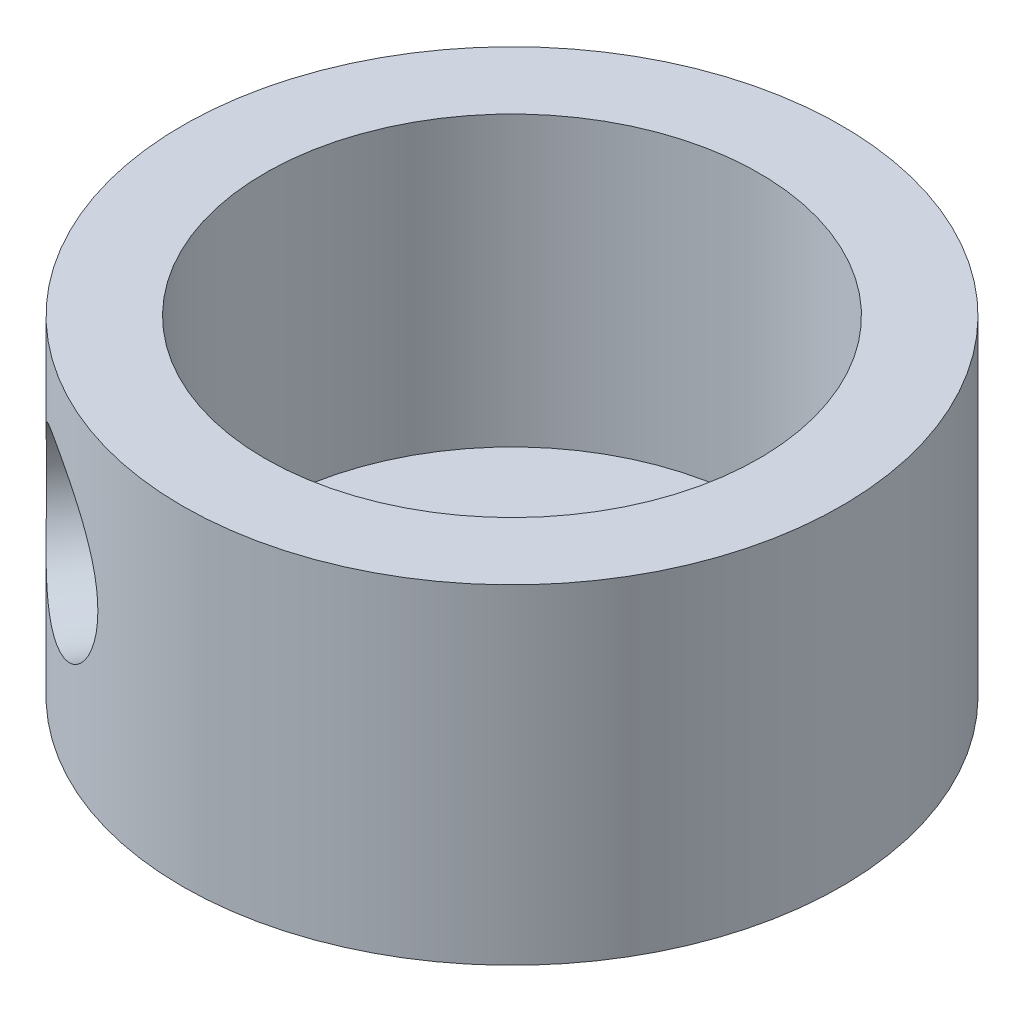
ISO-10303-21;
HEADER;
FILE_DESCRIPTION(('STEP AP214'),'2;1');
FILE_NAME('part.step','',(''),(''),'','','');
FILE_SCHEMA(('AUTOMOTIVE_DESIGN { 1 0 10303 214 1 1 1 1 }'));
ENDSEC;
DATA;
#1=APPLICATION_CONTEXT('core data for automotive mechanical design processes');
#2=APPLICATION_PROTOCOL_DEFINITION('international standard','automotive_design',2000,#1);
#3=PRODUCT_CONTEXT('',#1,'mechanical');
#4=PRODUCT('Part','Part','',(#3));
#5=PRODUCT_RELATED_PRODUCT_CATEGORY('part','',(#4));
#6=PRODUCT_DEFINITION_FORMATION('','',#4);
#7=PRODUCT_DEFINITION_CONTEXT('part definition',#1,'design');
#8=PRODUCT_DEFINITION('design','',#6,#7);
#9=PRODUCT_DEFINITION_SHAPE('','',#8);
#10=(LENGTH_UNIT() NAMED_UNIT(*) SI_UNIT(.MILLI.,.METRE.));
#11=(NAMED_UNIT(*) PLANE_ANGLE_UNIT() SI_UNIT($,.RADIAN.));
#12=(NAMED_UNIT(*) SI_UNIT($,.STERADIAN.) SOLID_ANGLE_UNIT());
#13=UNCERTAINTY_MEASURE_WITH_UNIT(LENGTH_MEASURE(1.E-05),#10,'distance_accuracy_value','');
#14=(GEOMETRIC_REPRESENTATION_CONTEXT(3) GLOBAL_UNCERTAINTY_ASSIGNED_CONTEXT((#13)) GLOBAL_UNIT_ASSIGNED_CONTEXT((#10,
#11,#12)) REPRESENTATION_CONTEXT('',''));
#15=CARTESIAN_POINT('',(0.,0.,0.));
#16=DIRECTION('',(0.,0.,1.));
#17=DIRECTION('',(1.,0.,0.));
#18=AXIS2_PLACEMENT_3D('',#15,#16,#17);
#19=CARTESIAN_POINT('',(0.,40.,0.));
#20=DIRECTION('',(0.,-1.,0.));
#21=DIRECTION('',(0.,0.,-1.));
#22=AXIS2_PLACEMENT_3D('',#19,#20,#21);
#23=CYLINDRICAL_SURFACE('',#22,40.);
#24=CARTESIAN_POINT('',(-12.1692253879626,21.9418173695324,38.1039361937447));
#25=CARTESIAN_POINT('',(-12.1692267008955,21.6524061057254,38.1039361952453));
#26=CARTESIAN_POINT('',(-12.1810513771062,21.362973564748,38.1001655139612));
#27=CARTESIAN_POINT('',(-12.2282117828224,20.7862139709595,38.0850553099959));
#28=CARTESIAN_POINT('',(-12.2635498384767,20.4988871293061,38.0737150384643));
#29=CARTESIAN_POINT('',(-12.357334717333,19.9283102835781,38.0433792550439));
#30=CARTESIAN_POINT('',(-12.4157917169252,19.6450621318229,38.0243803719516));
#31=CARTESIAN_POINT('',(-12.5551335186714,19.0847779407023,37.9785991282147));
#32=CARTESIAN_POINT('',(-12.6360189102535,18.807742064805,37.9518165630105));
#33=CARTESIAN_POINT('',(-12.8191765643407,18.2621847864961,37.8903420520787));
#34=CARTESIAN_POINT('',(-12.9214182721969,17.9936518442132,37.855661399875));
#35=CARTESIAN_POINT('',(-13.1462635681445,17.4664712282518,37.778166768958));
#36=CARTESIAN_POINT('',(-13.2688672417041,17.2078235960718,37.7353527561053));
#37=CARTESIAN_POINT('',(-13.5331730858816,16.7021095761881,37.6413719958643));
#38=CARTESIAN_POINT('',(-13.6748728453942,16.4550417316995,37.5902063028017));
#39=CARTESIAN_POINT('',(-13.976065713182,15.9739214188942,37.4792655005315));
#40=CARTESIAN_POINT('',(-14.1355647261885,15.7398733085645,37.4194875323589));
#41=CARTESIAN_POINT('',(-14.474505417927,15.2813904311062,37.2897080268784));
#42=CARTESIAN_POINT('',(-14.6543052526515,15.057275254471,37.2195124900569));
#43=CARTESIAN_POINT('',(-15.029275425357,14.625672699787,37.0696861739529));
#44=CARTESIAN_POINT('',(-15.2244459454494,14.4181855188051,36.990055282875));
#45=CARTESIAN_POINT('',(-15.6284988523279,14.0211371812701,36.8211620039586));
#46=CARTESIAN_POINT('',(-15.8373850145809,13.8315809958751,36.7318969597639));
#47=CARTESIAN_POINT('',(-16.2669614380952,13.4717949658277,36.5436851864258));
#48=CARTESIAN_POINT('',(-16.4876475332546,13.3015583655956,36.4447418642096));
#49=CARTESIAN_POINT('',(-16.9425966886944,12.9790047618284,36.235508452014));
#50=CARTESIAN_POINT('',(-17.1770185813707,12.8270113060357,36.1250645183413));
#51=CARTESIAN_POINT('',(-17.6542109066331,12.545254159727,35.8942763030943));
#52=CARTESIAN_POINT('',(-17.8969814516914,12.4154907688333,35.7739318881113));
#53=CARTESIAN_POINT('',(-18.3887784105217,12.1792419517963,35.5236391176051));
#54=CARTESIAN_POINT('',(-18.6378040311446,12.0727535908062,35.3936919756986));
#55=CARTESIAN_POINT('',(-19.140030148405,11.883926864499,35.1246407095224));
#56=CARTESIAN_POINT('',(-19.3932305374529,11.8015878778434,34.9855368209592));
#57=CARTESIAN_POINT('',(-19.896021008704,11.6633317736928,34.7020141115305));
#58=CARTESIAN_POINT('',(-20.1455662164313,11.6068679674241,34.5577821932474));
#59=CARTESIAN_POINT('',(-20.6446228150314,11.518201867452,34.2619858881538));
#60=CARTESIAN_POINT('',(-20.8941342063128,11.4859992482292,34.1104215997527));
#61=CARTESIAN_POINT('',(-21.3911352347049,11.4461435851059,33.8009617487546));
#62=CARTESIAN_POINT('',(-21.6386251522031,11.438487076823,33.643067082798));
#63=CARTESIAN_POINT('',(-22.1297370413295,11.4477828359071,33.3220766182041));
#64=CARTESIAN_POINT('',(-22.3733590661844,11.4647347643359,33.1589808912325));
#65=CARTESIAN_POINT('',(-22.8490610583845,11.522378764757,32.8329335262139));
#66=CARTESIAN_POINT('',(-23.0812775784324,11.56247943046,32.6700761276478));
#67=CARTESIAN_POINT('',(-23.5388194080397,11.6656152779254,32.3419731937816));
#68=CARTESIAN_POINT('',(-23.7641448492847,11.7286500211301,32.1767277042058));
#69=CARTESIAN_POINT('',(-24.2065365827703,11.8771427976013,31.8452507327506));
#70=CARTESIAN_POINT('',(-24.423602591382,11.9626016001157,31.6790192172371));
#71=CARTESIAN_POINT('',(-24.8482463182025,12.1552712343312,31.3470460655612));
#72=CARTESIAN_POINT('',(-25.0558238902644,12.262482400938,31.181304436981));
#73=CARTESIAN_POINT('',(-25.462343646605,12.4989712164321,30.8502581339815));
#74=CARTESIAN_POINT('',(-25.6611849701708,12.6284489654126,30.684972594657));
#75=CARTESIAN_POINT('',(-26.0472303631279,12.9078595658856,30.3579613431688));
#76=CARTESIAN_POINT('',(-26.2344300786855,13.0578000040229,30.196236977277));
#77=CARTESIAN_POINT('',(-26.5962617391237,13.3770204033584,29.8780337390284));
#78=CARTESIAN_POINT('',(-26.7708967605732,13.546295603833,29.7215535876299));
#79=CARTESIAN_POINT('',(-27.1070416268895,13.903173853733,29.4153025609572));
#80=CARTESIAN_POINT('',(-27.2685453986238,14.0907852962332,29.2655348043382));
#81=CARTESIAN_POINT('',(-27.5823684072209,14.4889263812809,28.9699981213541));
#82=CARTESIAN_POINT('',(-27.7342704257418,14.6999724404849,28.8244814268118));
#83=CARTESIAN_POINT('',(-28.0228325646942,15.1386748345272,28.5440244462936));
#84=CARTESIAN_POINT('',(-28.1594992474103,15.3663239475243,28.4090796142244));
#85=CARTESIAN_POINT('',(-28.4172579625968,15.836945843765,28.1512469733754));
#86=CARTESIAN_POINT('',(-28.538342398712,16.0799260155382,28.0283650521437));
#87=CARTESIAN_POINT('',(-28.7643973337685,16.5794195509303,27.7963249976253));
#88=CARTESIAN_POINT('',(-28.8693741563245,16.8359275503044,27.6871614817543));
#89=CARTESIAN_POINT('',(-29.0634895907983,17.3624458011271,27.4833315279053));
#90=CARTESIAN_POINT('',(-29.15252854211,17.6325283505538,27.3887567901486));
#91=CARTESIAN_POINT('',(-29.3136546209009,18.1828791405613,27.2162377282245));
#92=CARTESIAN_POINT('',(-29.3857416248322,18.4631474553598,27.1382935252628));
#93=CARTESIAN_POINT('',(-29.5126708376414,19.0318002867341,27.0002048783374));
#94=CARTESIAN_POINT('',(-29.5675164274598,19.3201831999854,26.9400569447656));
#95=CARTESIAN_POINT('',(-29.659756574985,19.9029719417634,26.8384716024016));
#96=CARTESIAN_POINT('',(-29.6971516470086,20.1973775925157,26.7970336421741));
#97=CARTESIAN_POINT('',(-29.7535034127387,20.7813622454133,26.7344488203575));
#98=CARTESIAN_POINT('',(-29.7729635473698,21.0708334917613,26.7127481713975));
#99=CARTESIAN_POINT('',(-29.7952024817744,21.6512083352435,26.687940924605));
#100=CARTESIAN_POINT('',(-29.7979816027159,21.9421119046925,26.6848339687789));
#101=CARTESIAN_POINT('',(-29.7868478560983,22.5231713015332,26.6972613288431));
#102=CARTESIAN_POINT('',(-29.7729365630349,22.8133271968694,26.7127938863688));
#103=CARTESIAN_POINT('',(-29.7284825690653,23.3907799331844,26.7622575046431));
#104=CARTESIAN_POINT('',(-29.6979399546191,23.6780767890185,26.7961884697452));
#105=CARTESIAN_POINT('',(-29.6210673712667,24.2424469616863,26.8811379486277));
#106=CARTESIAN_POINT('',(-29.5750401724093,24.5196110805546,26.9318284579706));
#107=CARTESIAN_POINT('',(-29.4672598545887,25.0672834816666,27.0497129013157));
#108=CARTESIAN_POINT('',(-29.4055069818024,25.3377918680295,27.116906576969));
#109=CARTESIAN_POINT('',(-29.2665033120336,25.8703450523375,27.2668704901096));
#110=CARTESIAN_POINT('',(-29.1892538331972,26.1323905679375,27.3496394027254));
#111=CARTESIAN_POINT('',(-29.0194865072897,26.6464641388745,27.5297059648681));
#112=CARTESIAN_POINT('',(-28.9269628197408,26.8984883163812,27.6270091705876));
#113=CARTESIAN_POINT('',(-28.7248718725057,27.396015925202,27.8370870123837));
#114=CARTESIAN_POINT('',(-28.6149879218402,27.641271825248,27.9501432734155));
#115=CARTESIAN_POINT('',(-28.3799534982687,28.1181562165687,28.1887617080455));
#116=CARTESIAN_POINT('',(-28.2547961446279,28.3497784956674,28.3143295134399));
#117=CARTESIAN_POINT('',(-27.9896440963899,28.7978650373007,28.5764688816687));
#118=CARTESIAN_POINT('',(-27.8496470305263,29.0143268681126,28.7130422022572));
#119=CARTESIAN_POINT('',(-27.5553671474869,29.4306030208981,28.9955741730295));
#120=CARTESIAN_POINT('',(-27.4010904750463,29.6304244338252,29.1415287781156));
#121=CARTESIAN_POINT('',(-27.0741648903355,30.0176713715582,29.445556753111));
#122=CARTESIAN_POINT('',(-26.9011189505242,30.2045844522948,29.603856450927));
#123=CARTESIAN_POINT('',(-26.5411974896133,30.5582003417578,29.9269659315223));
#124=CARTESIAN_POINT('',(-26.3543271118801,30.7249106066241,30.0917732826022));
#125=CARTESIAN_POINT('',(-25.9674861654638,31.0370191712834,30.4262228461374));
#126=CARTESIAN_POINT('',(-25.7675134380803,31.1824139463657,30.5958658526853));
#127=CARTESIAN_POINT('',(-25.3554691233878,31.4507465808206,30.9381950731188));
#128=CARTESIAN_POINT('',(-25.1433977291198,31.5736847983684,31.1108812384187));
#129=CARTESIAN_POINT('',(-24.7099391825488,31.7952788400849,31.4562411446642));
#130=CARTESIAN_POINT('',(-24.4886344175504,31.8941109253509,31.628905143181));
#131=CARTESIAN_POINT('',(-24.0365254512324,32.067863722887,31.9738374054647));
#132=CARTESIAN_POINT('',(-23.805721267782,32.1427844801338,32.1461056699754));
#133=CARTESIAN_POINT('',(-23.336132915562,32.2680531551015,32.4886031497597));
#134=CARTESIAN_POINT('',(-23.0973501783566,32.3184054560264,32.6588327234615));
#135=CARTESIAN_POINT('',(-22.6134171880446,32.3941047253895,32.9957615314371));
#136=CARTESIAN_POINT('',(-22.3682670911347,32.4194523066209,33.1624608521291));
#137=CARTESIAN_POINT('',(-21.8807731193549,32.4445340306979,33.4860388902287));
#138=CARTESIAN_POINT('',(-21.6385630077092,32.4450083019258,33.6430622288873));
#139=CARTESIAN_POINT('',(-21.1516020890951,32.42220056179,33.9513293357124));
#140=CARTESIAN_POINT('',(-20.906851336052,32.3989190536283,34.1025732262304));
#141=CARTESIAN_POINT('',(-20.4166513709503,32.3288022182398,34.3982889875869));
#142=CARTESIAN_POINT('',(-20.1712021875066,32.2819678425509,34.5427611317467));
#143=CARTESIAN_POINT('',(-19.681472994388,32.1651413898556,34.8241205975523));
#144=CARTESIAN_POINT('',(-19.4371929899558,32.0951492091072,34.9610078852162));
#145=CARTESIAN_POINT('',(-18.9533263740835,31.9331268292183,35.2256577020736));
#146=CARTESIAN_POINT('',(-18.7137192781513,31.8412474994141,35.3534752453339));
#147=CARTESIAN_POINT('',(-18.2392857029248,31.635884274607,35.6005621513135));
#148=CARTESIAN_POINT('',(-18.0044609830951,31.5223925817374,35.719828407233));
#149=CARTESIAN_POINT('',(-17.5415165671477,31.2746803198402,35.9494361352672));
#150=CARTESIAN_POINT('',(-17.3133962355257,31.1404617230936,36.0597784550237));
#151=CARTESIAN_POINT('',(-16.8655945434698,30.8522302740959,36.2713807319676));
#152=CARTESIAN_POINT('',(-16.6459136029976,30.6982164384455,36.3726402375091));
#153=CARTESIAN_POINT('',(-16.2111359453675,30.3671859971198,36.5685301165819));
#154=CARTESIAN_POINT('',(-15.9963065628766,30.1896757696529,36.6629199483829));
#155=CARTESIAN_POINT('',(-15.5791359941981,29.8161151439302,36.8421236018837));
#156=CARTESIAN_POINT('',(-15.376795002313,29.6200644573298,36.9269372746082));
#157=CARTESIAN_POINT('',(-14.9862781005191,29.2106532857522,37.0871410602621));
#158=CARTESIAN_POINT('',(-14.7981058950849,28.9972883039844,37.1625287121079));
#159=CARTESIAN_POINT('',(-14.4376505080415,28.5546658553656,37.3040446449664));
#160=CARTESIAN_POINT('',(-14.2653670370309,28.3254086781123,37.3701730946399));
#161=CARTESIAN_POINT('',(-13.9347715372588,27.8473952101069,37.4947198714325));
#162=CARTESIAN_POINT('',(-13.776836861136,27.5983268720052,37.5529431820243));
#163=CARTESIAN_POINT('',(-13.4808431419729,27.0868863236942,37.6602131195836));
#164=CARTESIAN_POINT('',(-13.3427768335998,26.8245190242614,37.7092631029684));
#165=CARTESIAN_POINT('',(-13.0879713371768,26.2882963774668,37.798455384137));
#166=CARTESIAN_POINT('',(-12.9712238392585,26.0144455576738,37.8386011540133));
#167=CARTESIAN_POINT('',(-12.7603141774663,25.4571073275395,37.9102467005543));
#168=CARTESIAN_POINT('',(-12.6661488440015,25.173621275966,37.9417476906741));
#169=CARTESIAN_POINT('',(-12.5155241802033,24.6480151792859,37.9916676789133));
#170=CARTESIAN_POINT('',(-12.4553748149914,24.4070691971378,38.0114008179503));
#171=CARTESIAN_POINT('',(-12.3518825477692,23.9212061614274,38.0451569673243));
#172=CARTESIAN_POINT('',(-12.3085384621869,23.6762893887886,38.0591803797927));
#173=CARTESIAN_POINT('',(-12.2390318019766,23.1837554072029,38.0815892126762));
#174=CARTESIAN_POINT('',(-12.2128704391076,22.9361380090544,38.089974235462));
#175=CARTESIAN_POINT('',(-12.1779689376924,22.4396245432522,38.1011469959573));
#176=CARTESIAN_POINT('',(-12.1692242587598,22.1907288258134,38.103936192454));
#177=CARTESIAN_POINT('',(-12.1692253879626,21.9418173695324,38.1039361937447));
#178=B_SPLINE_CURVE_WITH_KNOTS('',3,(#24,#25,#26,#27,#28,#29,#30,#31,#32,#33,#34,#35,#36,#37,
#38,#39,#40,#41,#42,#43,#44,#45,#46,#47,#48,#49,#50,#51,#52,#53,#54,#55,#56,#57,#58,#59,#60,#61,
#62,#63,#64,#65,#66,#67,#68,#69,#70,#71,#72,#73,#74,#75,#76,#77,#78,#79,#80,#81,#82,#83,#84,#85,
#86,#87,#88,#89,#90,#91,#92,#93,#94,#95,#96,#97,#98,#99,#100,#101,#102,#103,#104,#105,#106,#107,
#108,#109,#110,#111,#112,#113,#114,#115,#116,#117,#118,#119,#120,#121,#122,#123,#124,#125,#126,
#127,#128,#129,#130,#131,#132,#133,#134,#135,#136,#137,#138,#139,#140,#141,#142,#143,#144,#145,
#146,#147,#148,#149,#150,#151,#152,#153,#154,#155,#156,#157,#158,#159,#160,#161,#162,#163,#164,
#165,#166,#167,#168,#169,#170,#171,#172,#173,#174,#175,#176,#177),.UNSPECIFIED.,.T.,.F.,(4,2,2,
2,2,2,2,2,2,2,2,2,2,2,2,2,2,2,2,2,2,2,2,2,2,2,2,2,2,2,2,2,2,2,2,2,2,2,2,2,2,2,2,2,2,2,2,2,2,2,2,
2,2,2,2,2,2,2,2,2,2,2,2,2,2,2,2,2,2,2,2,2,2,2,2,2,4),(0.,0.868005652453133,1.73609718837711,
2.60457126288123,3.47306816343381,4.34033090665711,5.20759729025118,6.07475427368512,
6.94219978811813,7.82850263944516,8.7148159932442,9.60137435124388,10.4876217403081,
11.3877926771605,12.2879757457839,13.1880452409544,14.0880915762311,14.968129078031,
15.8481547719047,16.7280562554819,17.6079456200664,18.4662921134657,19.3246221939684,
20.1829817229697,21.041354468518,21.9078879402575,22.7747435608817,23.6413861972599,
24.5084273978284,25.4013109152475,26.2938083445773,27.1867392319127,28.0793186656924,
28.9772980494442,29.8752839775695,30.7730937059046,31.6708769715437,32.5426147434665,
33.4143357313299,34.285974491576,35.1576087205456,36.0131047956475,36.868587479242,
37.7239974260461,38.579735221206,39.4534161295581,40.3274920981572,41.2017079482026,
42.0755493432664,42.9741795966059,43.872477180906,44.7709231397697,45.6693547674428,
46.5610057676864,47.4526550907479,48.3441452784079,49.2356136176887,50.1005399603164,
50.9654479822019,51.8303210645343,52.6951980213626,53.5542775673273,54.4136676634974,
55.2729760342201,56.1323271106774,57.0140020122604,57.8956906280675,58.7776089694766,
59.6595112442365,60.5602641122477,61.460686757351,62.3607576736123,63.260702183543,
64.0074349806629,64.7541151768995,65.5008480248303,66.2473861801537),.UNSPECIFIED.);
#179=CARTESIAN_POINT('',(-12.1692253879626,21.9418173695324,38.1039361937447));
#180=VERTEX_POINT('',#179);
#181=EDGE_CURVE('E47',#180,#180,#178,.T.);
#182=ORIENTED_EDGE('',*,*,#181,.T.);
#183=EDGE_LOOP('',(#182));
#184=FACE_BOUND('',#183,.T.);
#185=CARTESIAN_POINT('',(0.,40.,0.));
#186=DIRECTION('',(0.,1.,0.));
#187=DIRECTION('',(0.,0.,1.));
#188=AXIS2_PLACEMENT_3D('',#185,#186,#187);
#189=CIRCLE('',#188,40.);
#190=CARTESIAN_POINT('',(0.,40.,40.));
#191=VERTEX_POINT('',#190);
#192=EDGE_CURVE('E10',#191,#191,#189,.T.);
#193=ORIENTED_EDGE('',*,*,#192,.F.);
#194=EDGE_LOOP('',(#193));
#195=FACE_BOUND('',#194,.T.);
#196=CARTESIAN_POINT('',(0.,0.,0.));
#197=DIRECTION('',(0.,1.,0.));
#198=DIRECTION('',(0.,0.,1.));
#199=AXIS2_PLACEMENT_3D('',#196,#197,#198);
#200=CIRCLE('',#199,40.);
#201=CARTESIAN_POINT('',(0.,0.,40.));
#202=VERTEX_POINT('',#201);
#203=EDGE_CURVE('E35',#202,#202,#200,.T.);
#204=ORIENTED_EDGE('',*,*,#203,.T.);
#205=EDGE_LOOP('',(#204));
#206=FACE_BOUND('',#205,.T.);
#207=ADVANCED_FACE('F31',(#184,#195,#206),#23,.T.);
#208=CARTESIAN_POINT('',(0.,40.,0.));
#209=DIRECTION('',(0.,1.,0.));
#210=DIRECTION('',(0.,0.,1.));
#211=AXIS2_PLACEMENT_3D('',#208,#209,#210);
#212=PLANE('',#211);
#213=CARTESIAN_POINT('',(0.,40.,0.));
#214=DIRECTION('',(0.,1.,0.));
#215=DIRECTION('',(0.,0.,1.));
#216=AXIS2_PLACEMENT_3D('',#213,#214,#215);
#217=CIRCLE('',#216,30.);
#218=CARTESIAN_POINT('',(0.,40.,30.));
#219=VERTEX_POINT('',#218);
#220=EDGE_CURVE('E44',#219,#219,#217,.T.);
#221=ORIENTED_EDGE('',*,*,#220,.F.);
#222=EDGE_LOOP('',(#221));
#223=FACE_BOUND('',#222,.T.);
#224=ORIENTED_EDGE('',*,*,#192,.T.);
#225=EDGE_LOOP('',(#224));
#226=FACE_BOUND('',#225,.T.);
#227=ADVANCED_FACE('F77',(#223,#226),#212,.T.);
#228=CARTESIAN_POINT('',(0.,0.,0.));
#229=DIRECTION('',(0.,1.,0.));
#230=DIRECTION('',(0.,0.,1.));
#231=AXIS2_PLACEMENT_3D('',#228,#229,#230);
#232=PLANE('',#231);
#233=ORIENTED_EDGE('',*,*,#203,.F.);
#234=EDGE_LOOP('',(#233));
#235=FACE_BOUND('',#234,.T.);
#236=ADVANCED_FACE('F75',(#235),#232,.F.);
#237=CARTESIAN_POINT('',(0.,5.,0.));
#238=DIRECTION('',(0.,1.,0.));
#239=DIRECTION('',(0.,0.,1.));
#240=AXIS2_PLACEMENT_3D('',#237,#238,#239);
#241=CYLINDRICAL_SURFACE('',#240,30.);
#242=CARTESIAN_POINT('',(-6.46405933262994,21.9418173695324,29.2953227827283));
#243=CARTESIAN_POINT('',(-6.46405860267126,22.2268356966163,29.295322689692));
#244=CARTESIAN_POINT('',(-6.47617134123439,22.5118458590297,29.2926580557763));
#245=CARTESIAN_POINT('',(-6.52444105103412,23.0797107169084,29.2819446098088));
#246=CARTESIAN_POINT('',(-6.56059714278754,23.362565490833,29.273895994698));
#247=CARTESIAN_POINT('',(-6.65643451474172,23.9240536342009,29.2522526413));
#248=CARTESIAN_POINT('',(-6.71611712376494,24.2026867642743,29.2386575897381));
#249=CARTESIAN_POINT('',(-6.85818253289289,24.753748618966,29.2056611147829));
#250=CARTESIAN_POINT('',(-6.94056571035848,25.0261772403626,29.1862595948658));
#251=CARTESIAN_POINT('',(-7.12673595980626,25.5623630373157,29.1413584245918));
#252=CARTESIAN_POINT('',(-7.23047186129289,25.8261392274004,29.1158733302498));
#253=CARTESIAN_POINT('',(-7.45825514994594,26.3441383091024,29.0583589276308));
#254=CARTESIAN_POINT('',(-7.582310085592,26.5983576070355,29.0263271861878));
#255=CARTESIAN_POINT('',(-7.8493186183117,27.0956353151824,28.9552633027257));
#256=CARTESIAN_POINT('',(-7.99227202118491,27.3386938400496,28.9162312326406));
#257=CARTESIAN_POINT('',(-8.29561691091182,27.8122980330456,28.8306706248768));
#258=CARTESIAN_POINT('',(-8.45600952729929,28.0428428892154,28.784141601528));
#259=CARTESIAN_POINT('',(-8.79931542098473,28.4989266669634,28.6810983938504));
#260=CARTESIAN_POINT('',(-8.9828653861136,28.7239142932937,28.6242640705478));
#261=CARTESIAN_POINT('',(-9.36539864027722,29.1576754051913,28.5013974767708));
#262=CARTESIAN_POINT('',(-9.56438225142715,29.3664485521646,28.4353650142993));
#263=CARTESIAN_POINT('',(-9.97603222707465,29.7665590388786,28.293571182377));
#264=CARTESIAN_POINT('',(-10.188701231066,29.9578929978344,28.2178079333321));
#265=CARTESIAN_POINT('',(-10.6258432913486,30.321857883229,28.0561179678232));
#266=CARTESIAN_POINT('',(-10.850315989472,30.4944893766836,27.9701915596484));
#267=CARTESIAN_POINT('',(-11.3159400867619,30.8246729019546,27.785141309193));
#268=CARTESIAN_POINT('',(-11.5573878710842,30.9816319712193,27.6857036011781));
#269=CARTESIAN_POINT('',(-12.0485639171633,31.2732034511849,27.4755059594678));
#270=CARTESIAN_POINT('',(-12.298288841648,31.4078247398993,27.3647505523393));
#271=CARTESIAN_POINT('',(-12.8038916576969,31.6536442833029,27.131859748488));
#272=CARTESIAN_POINT('',(-13.0597694269601,31.7648430031381,27.0097245778242));
#273=CARTESIAN_POINT('',(-13.5753820991579,31.9627812060115,26.7542847888806));
#274=CARTESIAN_POINT('',(-13.8351168178627,32.0495218533753,26.6209807026886));
#275=CARTESIAN_POINT('',(-14.3461827286018,32.1948605038312,26.3489587103013));
#276=CARTESIAN_POINT('',(-14.5974576445492,32.2544037241027,26.2106397783674));
#277=CARTESIAN_POINT('',(-15.0993081970644,32.3494755141936,25.9247809886034));
#278=CARTESIAN_POINT('',(-15.3498838496657,32.3850046392139,25.7772413440405));
#279=CARTESIAN_POINT('',(-15.8482058747184,32.4316804216233,25.4738971561556));
#280=CARTESIAN_POINT('',(-16.0959529209313,32.4428330112375,25.3180946331268));
#281=CARTESIAN_POINT('',(-16.586692883999,32.4406565678234,24.9993443238581));
#282=CARTESIAN_POINT('',(-16.8296859234958,32.4273281671901,24.8363967222967));
#283=CARTESIAN_POINT('',(-17.2986952203289,32.3774358281665,24.5118935976791));
#284=CARTESIAN_POINT('',(-17.5249911879668,32.341901769608,24.3505826767432));
#285=CARTESIAN_POINT('',(-17.9700759569619,32.2488886933543,24.0239995785818));
#286=CARTESIAN_POINT('',(-18.1888650138897,32.1914104235529,23.8587275365376));
#287=CARTESIAN_POINT('',(-18.6176633819252,32.0550220840179,23.525652458162));
#288=CARTESIAN_POINT('',(-18.8276723697161,31.9761112258524,23.357849328935));
#289=CARTESIAN_POINT('',(-19.2378137067506,31.7975281820049,23.0212275243502));
#290=CARTESIAN_POINT('',(-19.4379458212639,31.6978555031983,22.8524088249635));
#291=CARTESIAN_POINT('',(-19.8300691074867,31.4770533681901,22.5130297367548));
#292=CARTESIAN_POINT('',(-20.0219130898796,31.3556512864779,22.342476771742));
#293=CARTESIAN_POINT('',(-20.3938376066608,31.0932042656411,22.0035162338562));
#294=CARTESIAN_POINT('',(-20.5739138529977,30.9521522242471,21.8351094608311));
#295=CARTESIAN_POINT('',(-20.9216526242175,30.6514133835624,21.5021489060274));
#296=CARTESIAN_POINT('',(-21.0893145365642,30.4917256657681,21.3375953146424));
#297=CARTESIAN_POINT('',(-21.4117776927658,30.1547411537015,21.013994493983));
#298=CARTESIAN_POINT('',(-21.5665781440488,29.9774432757001,20.8549476044042));
#299=CARTESIAN_POINT('',(-21.8706248144044,29.5967227831766,20.5359876606539));
#300=CARTESIAN_POINT('',(-22.0191725057783,29.3924242843822,20.3764532137309));
#301=CARTESIAN_POINT('',(-22.3013696569487,28.9668055234791,20.067205651461));
#302=CARTESIAN_POINT('',(-22.4350186562842,28.7454847356343,19.9174928397217));
#303=CARTESIAN_POINT('',(-22.6872121602836,28.2871089747485,19.6297483553926));
#304=CARTESIAN_POINT('',(-22.8057534021174,28.0500506196136,19.4917192082843));
#305=CARTESIAN_POINT('',(-23.0274968309209,27.5616770625128,19.2292463411979));
#306=CARTESIAN_POINT('',(-23.130699697648,27.3103624930282,19.1048020192403));
#307=CARTESIAN_POINT('',(-23.3232638070407,26.7905041453831,18.8692586286329));
#308=CARTESIAN_POINT('',(-23.4123520755623,26.521736237495,18.758430340706));
#309=CARTESIAN_POINT('',(-23.5742613631461,25.9729266687652,18.5545453858188));
#310=CARTESIAN_POINT('',(-23.6470891837235,25.692889779648,18.4614812907202));
#311=CARTESIAN_POINT('',(-23.7763455548188,25.123464344633,18.2947132565267));
#312=CARTESIAN_POINT('',(-23.8327768707525,24.834077384867,18.2210060529224));
#313=CARTESIAN_POINT('',(-23.9291010056423,24.2481034178066,18.0943215888246));
#314=CARTESIAN_POINT('',(-23.9689947842971,23.9515168293754,18.0413431254206));
#315=CARTESIAN_POINT('',(-24.03057263915,23.368222735631,17.959233735686));
#316=CARTESIAN_POINT('',(-24.0530552895739,23.0817460628671,17.9290587629062));
#317=CARTESIAN_POINT('',(-24.0828931128658,22.5065969462951,17.8889600461083));
#318=CARTESIAN_POINT('',(-24.0902487813833,22.2179245747421,17.8790356385618));
#319=CARTESIAN_POINT('',(-24.0898100603609,21.6406672488647,17.879626668726));
#320=CARTESIAN_POINT('',(-24.0820184479284,21.3520822882161,17.8901383596756));
#321=CARTESIAN_POINT('',(-24.0513153615244,20.7771767655449,17.9313939414174));
#322=CARTESIAN_POINT('',(-24.0284041115175,20.4908561700441,17.9621375325179));
#323=CARTESIAN_POINT('',(-23.9687356814267,19.9338719813011,18.041675835266));
#324=CARTESIAN_POINT('',(-23.9325609520922,19.6630365744991,18.0897098356722));
#325=CARTESIAN_POINT('',(-23.8464058021614,19.1271628995993,18.2031315508569));
#326=CARTESIAN_POINT('',(-23.7964205139439,18.8621267110836,18.268525383902));
#327=CARTESIAN_POINT('',(-23.6827775562266,18.339695128617,18.4156094787133));
#328=CARTESIAN_POINT('',(-23.6191230541978,18.0822979802259,18.4972959647857));
#329=CARTESIAN_POINT('',(-23.4782353417345,17.5765194439144,18.6757968864519));
#330=CARTESIAN_POINT('',(-23.4009968708906,17.3281415938486,18.772617181011));
#331=CARTESIAN_POINT('',(-23.2302613763779,16.8337116780714,18.9835183993586));
#332=CARTESIAN_POINT('',(-23.1363044915201,16.5880194972954,19.098070724985));
#333=CARTESIAN_POINT('',(-22.9341505697127,16.10917787456,19.3403627817306));
#334=CARTESIAN_POINT('',(-22.8259471733328,15.8760340998867,19.4681083966144));
#335=CARTESIAN_POINT('',(-22.5954888512116,15.4236868694687,19.7351204177617));
#336=CARTESIAN_POINT('',(-22.4732330408476,15.2044842926959,19.8743875491687));
#337=CARTESIAN_POINT('',(-22.2148635836095,14.7812466902801,20.1627704429732));
#338=CARTESIAN_POINT('',(-22.078749566624,14.5772120699797,20.3118864683678));
#339=CARTESIAN_POINT('',(-21.785144454605,14.1748466242731,20.6265908922746));
#340=CARTESIAN_POINT('',(-21.6268947038571,13.9774237876319,20.7926340382017));
#341=CARTESIAN_POINT('',(-21.2956681571097,13.6020945020879,21.1317454737432));
#342=CARTESIAN_POINT('',(-21.1226966432035,13.4241811052915,21.3048112321161));
#343=CARTESIAN_POINT('',(-20.7623800711911,13.0889754974359,21.6561052925992));
#344=CARTESIAN_POINT('',(-20.5750291779991,12.9316917286683,21.8343356720323));
#345=CARTESIAN_POINT('',(-20.1867425654925,12.63910380351,22.1938140092438));
#346=CARTESIAN_POINT('',(-19.9858126590286,12.503790325516,22.3750606510997));
#347=CARTESIAN_POINT('',(-19.5722680950864,12.2568673203744,22.7376675903545));
#348=CARTESIAN_POINT('',(-19.3597225107104,12.1451335509077,22.9190219714608));
#349=CARTESIAN_POINT('',(-18.9230292006034,11.9454595581881,23.2808797752969));
#350=CARTESIAN_POINT('',(-18.6988814460524,11.8575193940427,23.4613831959116));
#351=CARTESIAN_POINT('',(-18.2403835609235,11.7063137392472,23.8195929029585));
#352=CARTESIAN_POINT('',(-18.0060368528144,11.6430400411547,23.9973001008778));
#353=CARTESIAN_POINT('',(-17.5286524852041,11.5417812391288,24.348184214129));
#354=CARTESIAN_POINT('',(-17.2856152477684,11.5037949088385,24.5213613487631));
#355=CARTESIAN_POINT('',(-16.8053608952839,11.4548083452311,24.8527774403328));
#356=CARTESIAN_POINT('',(-16.5684882886985,11.4425194985035,25.0113264572443));
#357=CARTESIAN_POINT('',(-16.0902697645151,11.441173818961,25.3216202320008));
#358=CARTESIAN_POINT('',(-15.8489240105054,11.4521161382099,25.4733652379852));
#359=CARTESIAN_POINT('',(-15.3636135616696,11.4971217074297,25.7689756366569));
#360=CARTESIAN_POINT('',(-15.1196491132867,11.531182800165,25.9128417631767));
#361=CARTESIAN_POINT('',(-14.6309868255277,11.6220937379006,26.1918572690241));
#362=CARTESIAN_POINT('',(-14.3862889850573,11.6789436169204,26.3270066353388));
#363=CARTESIAN_POINT('',(-13.902804380283,11.8135908470223,26.5854420358236));
#364=CARTESIAN_POINT('',(-13.6639944759278,11.8909640753848,26.7089063052911));
#365=CARTESIAN_POINT('',(-13.1892742515492,12.0664910917854,26.9464937832724));
#366=CARTESIAN_POINT('',(-12.9533649925301,12.1646522576779,27.06061365537));
#367=CARTESIAN_POINT('',(-12.4863379269101,12.3809487352663,27.2792567475343));
#368=CARTESIAN_POINT('',(-12.2552197849941,12.4990826437989,27.3837806409605));
#369=CARTESIAN_POINT('',(-11.7994794747271,12.7544634566338,27.5832225839582));
#370=CARTESIAN_POINT('',(-11.5748577511003,12.8917116657179,27.6781399770057));
#371=CARTESIAN_POINT('',(-11.1251615002782,13.1901151533819,27.8620185847004));
#372=CARTESIAN_POINT('',(-10.9004134699263,13.351995985252,27.9506011787787));
#373=CARTESIAN_POINT('',(-10.4615750276214,13.6942855957871,28.1177985436322));
#374=CARTESIAN_POINT('',(-10.247484839642,13.8746947635796,28.1964131049838));
#375=CARTESIAN_POINT('',(-9.83165984803782,14.2529638476479,28.3440852004043));
#376=CARTESIAN_POINT('',(-9.62992893206968,14.4508292075661,28.413139735847));
#377=CARTESIAN_POINT('',(-9.24061750061675,14.862781815947,28.5421276003336));
#378=CARTESIAN_POINT('',(-9.0530369193031,15.0768689889347,28.6020609718115));
#379=CARTESIAN_POINT('',(-8.68567460212069,15.5299464847233,28.7158087086395));
#380=CARTESIAN_POINT('',(-8.50661508630611,15.769621932815,28.7692303586823));
#381=CARTESIAN_POINT('',(-8.16771007694235,16.2637631627485,28.8672761311396));
#382=CARTESIAN_POINT('',(-8.00785748920814,16.5182234318955,28.9119035056907));
#383=CARTESIAN_POINT('',(-7.7090819094124,17.0404419102284,28.9929997063442));
#384=CARTESIAN_POINT('',(-7.5701614713065,17.3082017368177,29.0294675371541));
#385=CARTESIAN_POINT('',(-7.3149984592981,17.8552127277508,29.0948132226238));
#386=CARTESIAN_POINT('',(-7.19875525912081,18.1344635744904,29.123691286897));
#387=CARTESIAN_POINT('',(-6.99166124836082,18.6993634077367,29.1740966683618));
#388=CARTESIAN_POINT('',(-6.90054460679487,18.9849079065108,29.1957015201346));
#389=CARTESIAN_POINT('',(-6.74332515909462,19.5632219067165,29.2324151516885));
#390=CARTESIAN_POINT('',(-6.67722222717294,19.8559913718079,29.2475239641364));
#391=CARTESIAN_POINT('',(-6.57105828601423,20.4463566213926,29.2715589356991));
#392=CARTESIAN_POINT('',(-6.53098736538323,20.7439505247506,29.2804874479782));
#393=CARTESIAN_POINT('',(-6.4774888672928,21.3416385002389,29.2923692871823));
#394=CARTESIAN_POINT('',(-6.46406010117554,21.6417324602277,29.2953228806826));
#395=CARTESIAN_POINT('',(-6.46405933262994,21.9418173695324,29.2953227827283));
#396=B_SPLINE_CURVE_WITH_KNOTS('',3,(#242,#243,#244,#245,#246,#247,#248,#249,#250,#251,#252,
#253,#254,#255,#256,#257,#258,#259,#260,#261,#262,#263,#264,#265,#266,#267,#268,#269,#270,#271,
#272,#273,#274,#275,#276,#277,#278,#279,#280,#281,#282,#283,#284,#285,#286,#287,#288,#289,#290,
#291,#292,#293,#294,#295,#296,#297,#298,#299,#300,#301,#302,#303,#304,#305,#306,#307,#308,#309,
#310,#311,#312,#313,#314,#315,#316,#317,#318,#319,#320,#321,#322,#323,#324,#325,#326,#327,#328,
#329,#330,#331,#332,#333,#334,#335,#336,#337,#338,#339,#340,#341,#342,#343,#344,#345,#346,#347,
#348,#349,#350,#351,#352,#353,#354,#355,#356,#357,#358,#359,#360,#361,#362,#363,#364,#365,#366,
#367,#368,#369,#370,#371,#372,#373,#374,#375,#376,#377,#378,#379,#380,#381,#382,#383,#384,#385,
#386,#387,#388,#389,#390,#391,#392,#393,#394,#395),.UNSPECIFIED.,.T.,.F.,(4,2,2,2,2,2,2,2,2,2,2,
2,2,2,2,2,2,2,2,2,2,2,2,2,2,2,2,2,2,2,2,2,2,2,2,2,2,2,2,2,2,2,2,2,2,2,2,2,2,2,2,2,2,2,2,2,2,2,2,
2,2,2,2,2,2,2,2,2,2,2,2,2,2,2,2,2,4),(0.,0.854772678250439,1.70951409144226,2.56430378897511,
3.41910769688489,4.27188648327172,5.12498279679692,5.97807034459537,6.83121317962672,
7.71782870658503,8.60446274305232,9.49126829963867,10.3780469627787,11.2909113493426,
12.2034120500078,13.1158946277209,14.0283337594023,14.9060557303736,15.783757407902,
16.6612454659072,17.5387108568847,18.3782254661155,19.2177114659011,20.0572283517019,
20.8967651795704,21.7476860723677,22.5989153233249,23.4501865468762,24.301510190144,
25.1967527939384,26.0920230585567,26.987486348671,27.8829099423108,28.7939593076787,
29.7046268770787,30.6151407650408,31.5256018070818,32.3913175345262,33.2570048955449,
34.1225335561282,34.9880493960718,35.8193890124946,36.6510220145623,37.482462515692,
38.3142257050554,39.1739942532656,40.0341478988161,40.8943557221406,41.7545865250726,
42.6614252255425,43.5679399176065,44.474824434125,45.3813231644948,46.2829191913033,
47.1845174578128,48.0858154727756,48.9870697744724,49.8419259367028,50.6967508972736,
51.5514961042486,52.4062425872108,53.2445419446883,54.0831393234096,54.9216778118488,
55.7602735687419,56.6316974782126,57.5031396928548,58.3748546303409,59.2465655122664,
60.1571995895289,61.0674962783288,61.9779039436935,62.8882864628692,63.7886316430436,
64.6889722955582,65.5889699523355,66.4889274542033),.UNSPECIFIED.);
#397=CARTESIAN_POINT('',(-6.46405933262994,21.9418173695324,29.2953227827283));
#398=VERTEX_POINT('',#397);
#399=EDGE_CURVE('E56',#398,#398,#396,.T.);
#400=ORIENTED_EDGE('',*,*,#399,.T.);
#401=EDGE_LOOP('',(#400));
#402=FACE_BOUND('',#401,.T.);
#403=CARTESIAN_POINT('',(0.,5.,0.));
#404=DIRECTION('',(0.,1.,0.));
#405=DIRECTION('',(0.,0.,1.));
#406=AXIS2_PLACEMENT_3D('',#403,#404,#405);
#407=CIRCLE('',#406,30.);
#408=CARTESIAN_POINT('',(0.,5.,30.));
#409=VERTEX_POINT('',#408);
#410=EDGE_CURVE('E42',#409,#409,#407,.T.);
#411=ORIENTED_EDGE('',*,*,#410,.F.);
#412=EDGE_LOOP('',(#411));
#413=FACE_BOUND('',#412,.T.);
#414=ORIENTED_EDGE('',*,*,#220,.T.);
#415=EDGE_LOOP('',(#414));
#416=FACE_BOUND('',#415,.T.);
#417=ADVANCED_FACE('F71',(#402,#413,#416),#241,.F.);
#418=CARTESIAN_POINT('',(0.,5.,0.));
#419=DIRECTION('',(0.,1.,0.));
#420=DIRECTION('',(0.,0.,1.));
#421=AXIS2_PLACEMENT_3D('',#418,#419,#420);
#422=PLANE('',#421);
#423=ORIENTED_EDGE('',*,*,#410,.T.);
#424=EDGE_LOOP('',(#423));
#425=FACE_BOUND('',#424,.T.);
#426=ADVANCED_FACE('F64',(#425),#422,.T.);
#427=CARTESIAN_POINT('',(-21.7447581507004,21.9418173695324,33.5732854062207));
#428=DIRECTION('',(-0.543618953767509,0.,0.839332135155517));
#429=DIRECTION('',(0.839332135155517,0.,0.543618953767509));
#430=AXIS2_PLACEMENT_3D('',#427,#428,#429);
#431=CYLINDRICAL_SURFACE('',#430,10.5);
#432=ORIENTED_EDGE('',*,*,#399,.F.);
#433=EDGE_LOOP('',(#432));
#434=FACE_BOUND('',#433,.T.);
#435=ORIENTED_EDGE('',*,*,#181,.F.);
#436=EDGE_LOOP('',(#435));
#437=FACE_BOUND('',#436,.T.);
#438=ADVANCED_FACE('F61',(#434,#437),#431,.F.);
#439=CLOSED_SHELL('',(#207,#227,#236,#417,#426,#438));
#440=MANIFOLD_SOLID_BREP('B2',#439);
#441=ADVANCED_BREP_SHAPE_REPRESENTATION('',(#18,#440),#14);
#442=SHAPE_DEFINITION_REPRESENTATION(#9,#441);
ENDSEC;
END-ISO-10303-21;
